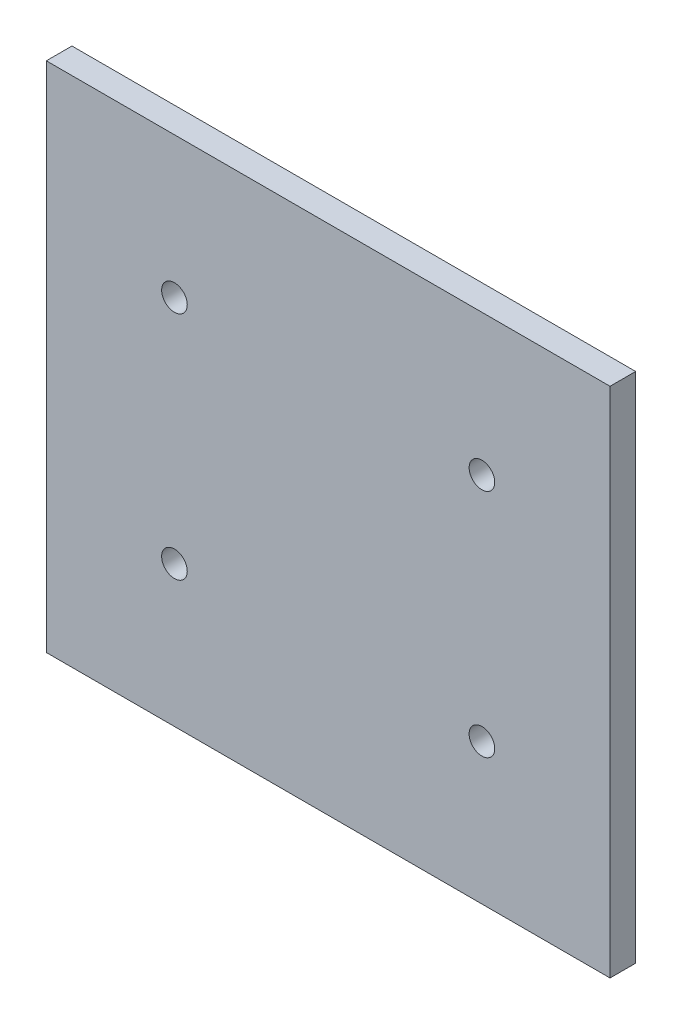
ISO-10303-21;
HEADER;
FILE_DESCRIPTION(('STEP AP214'),'2;1');
FILE_NAME('part.step','',(''),(''),'','','');
FILE_SCHEMA(('AUTOMOTIVE_DESIGN { 1 0 10303 214 1 1 1 1 }'));
ENDSEC;
DATA;
#1=APPLICATION_CONTEXT('core data for automotive mechanical design processes');
#2=APPLICATION_PROTOCOL_DEFINITION('international standard','automotive_design',2000,#1);
#3=PRODUCT_CONTEXT('',#1,'mechanical');
#4=PRODUCT('Part','Part','',(#3));
#5=PRODUCT_RELATED_PRODUCT_CATEGORY('part','',(#4));
#6=PRODUCT_DEFINITION_FORMATION('','',#4);
#7=PRODUCT_DEFINITION_CONTEXT('part definition',#1,'design');
#8=PRODUCT_DEFINITION('design','',#6,#7);
#9=PRODUCT_DEFINITION_SHAPE('','',#8);
#10=(LENGTH_UNIT() NAMED_UNIT(*) SI_UNIT(.MILLI.,.METRE.));
#11=(NAMED_UNIT(*) PLANE_ANGLE_UNIT() SI_UNIT($,.RADIAN.));
#12=(NAMED_UNIT(*) SI_UNIT($,.STERADIAN.) SOLID_ANGLE_UNIT());
#13=UNCERTAINTY_MEASURE_WITH_UNIT(LENGTH_MEASURE(1.E-05),#10,'distance_accuracy_value','');
#14=(GEOMETRIC_REPRESENTATION_CONTEXT(3) GLOBAL_UNCERTAINTY_ASSIGNED_CONTEXT((#13)) GLOBAL_UNIT_ASSIGNED_CONTEXT((#10,
#11,#12)) REPRESENTATION_CONTEXT('',''));
#15=CARTESIAN_POINT('',(0.,0.,0.));
#16=DIRECTION('',(0.,0.,1.));
#17=DIRECTION('',(1.,0.,0.));
#18=AXIS2_PLACEMENT_3D('',#15,#16,#17);
#19=CARTESIAN_POINT('',(0.,0.,3.175));
#20=DIRECTION('',(0.,0.,1.));
#21=DIRECTION('',(1.,0.,0.));
#22=AXIS2_PLACEMENT_3D('',#19,#20,#21);
#23=PLANE('',#22);
#24=CARTESIAN_POINT('',(38.1,0.,3.175));
#25=DIRECTION('',(0.,0.,1.));
#26=DIRECTION('',(1.,0.,0.));
#27=AXIS2_PLACEMENT_3D('',#24,#25,#26);
#28=CIRCLE('',#27,1.5875);
#29=CARTESIAN_POINT('',(39.6875,0.,3.175));
#30=VERTEX_POINT('',#29);
#31=EDGE_CURVE('E121',#30,#30,#28,.T.);
#32=ORIENTED_EDGE('',*,*,#31,.F.);
#33=EDGE_LOOP('',(#32));
#34=FACE_BOUND('',#33,.T.);
#35=CARTESIAN_POINT('',(0.,28.575,3.175));
#36=DIRECTION('',(0.,0.,1.));
#37=DIRECTION('',(1.,0.,0.));
#38=AXIS2_PLACEMENT_3D('',#35,#36,#37);
#39=CIRCLE('',#38,1.5875);
#40=CARTESIAN_POINT('',(1.5875,28.575,3.175));
#41=VERTEX_POINT('',#40);
#42=EDGE_CURVE('E100',#41,#41,#39,.T.);
#43=ORIENTED_EDGE('',*,*,#42,.F.);
#44=EDGE_LOOP('',(#43));
#45=FACE_BOUND('',#44,.T.);
#46=DIRECTION('',(0.,-1.,0.));
#47=VECTOR('',#46,1.);
#48=CARTESIAN_POINT('',(-15.875,46.0375,3.175));
#49=LINE('',#48,#47);
#50=CARTESIAN_POINT('',(-15.875,46.0375,3.175));
#51=VERTEX_POINT('',#50);
#52=CARTESIAN_POINT('',(-15.875,-17.4625,3.175));
#53=VERTEX_POINT('',#52);
#54=EDGE_CURVE('E85',#51,#53,#49,.T.);
#55=ORIENTED_EDGE('',*,*,#54,.T.);
#56=DIRECTION('',(1.,0.,0.));
#57=VECTOR('',#56,1.);
#58=CARTESIAN_POINT('',(-15.875,-17.4625,3.175));
#59=LINE('',#58,#57);
#60=CARTESIAN_POINT('',(53.975,-17.4625,3.175));
#61=VERTEX_POINT('',#60);
#62=EDGE_CURVE('E80',#53,#61,#59,.T.);
#63=ORIENTED_EDGE('',*,*,#62,.T.);
#64=DIRECTION('',(0.,1.,0.));
#65=VECTOR('',#64,1.);
#66=CARTESIAN_POINT('',(53.975,46.0375,3.175));
#67=LINE('',#66,#65);
#68=CARTESIAN_POINT('',(53.975,46.0375,3.175));
#69=VERTEX_POINT('',#68);
#70=EDGE_CURVE('E83',#61,#69,#67,.T.);
#71=ORIENTED_EDGE('',*,*,#70,.T.);
#72=DIRECTION('',(-1.,0.,0.));
#73=VECTOR('',#72,1.);
#74=CARTESIAN_POINT('',(-15.875,46.0375,3.175));
#75=LINE('',#74,#73);
#76=EDGE_CURVE('E50',#69,#51,#75,.T.);
#77=ORIENTED_EDGE('',*,*,#76,.T.);
#78=EDGE_LOOP('',(#55,#63,#71,#77));
#79=FACE_BOUND('',#78,.T.);
#80=CARTESIAN_POINT('',(38.1,28.575,3.175));
#81=DIRECTION('',(0.,0.,1.));
#82=DIRECTION('',(1.,0.,0.));
#83=AXIS2_PLACEMENT_3D('',#80,#81,#82);
#84=CIRCLE('',#83,1.5875);
#85=CARTESIAN_POINT('',(39.6875,28.575,3.175));
#86=VERTEX_POINT('',#85);
#87=EDGE_CURVE('E115',#86,#86,#84,.T.);
#88=ORIENTED_EDGE('',*,*,#87,.F.);
#89=EDGE_LOOP('',(#88));
#90=FACE_BOUND('',#89,.T.);
#91=CARTESIAN_POINT('',(0.,0.,3.175));
#92=DIRECTION('',(0.,0.,1.));
#93=DIRECTION('',(1.,0.,0.));
#94=AXIS2_PLACEMENT_3D('',#91,#92,#93);
#95=CIRCLE('',#94,1.5875);
#96=CARTESIAN_POINT('',(1.5875,0.,3.175));
#97=VERTEX_POINT('',#96);
#98=EDGE_CURVE('E127',#97,#97,#95,.T.);
#99=ORIENTED_EDGE('',*,*,#98,.F.);
#100=EDGE_LOOP('',(#99));
#101=FACE_BOUND('',#100,.T.);
#102=ADVANCED_FACE('F33',(#34,#45,#79,#90,#101),#23,.T.);
#103=CARTESIAN_POINT('',(0.,0.,0.));
#104=DIRECTION('',(0.,0.,1.));
#105=DIRECTION('',(1.,0.,0.));
#106=AXIS2_PLACEMENT_3D('',#103,#104,#105);
#107=PLANE('',#106);
#108=CARTESIAN_POINT('',(38.1,0.,0.));
#109=DIRECTION('',(0.,0.,1.));
#110=DIRECTION('',(1.,0.,0.));
#111=AXIS2_PLACEMENT_3D('',#108,#109,#110);
#112=CIRCLE('',#111,1.5875);
#113=CARTESIAN_POINT('',(39.6875,0.,0.));
#114=VERTEX_POINT('',#113);
#115=EDGE_CURVE('E124',#114,#114,#112,.T.);
#116=ORIENTED_EDGE('',*,*,#115,.T.);
#117=EDGE_LOOP('',(#116));
#118=FACE_BOUND('',#117,.T.);
#119=CARTESIAN_POINT('',(0.,28.575,0.));
#120=DIRECTION('',(0.,0.,1.));
#121=DIRECTION('',(1.,0.,0.));
#122=AXIS2_PLACEMENT_3D('',#119,#120,#121);
#123=CIRCLE('',#122,1.5875);
#124=CARTESIAN_POINT('',(1.5875,28.575,0.));
#125=VERTEX_POINT('',#124);
#126=EDGE_CURVE('E112',#125,#125,#123,.T.);
#127=ORIENTED_EDGE('',*,*,#126,.T.);
#128=EDGE_LOOP('',(#127));
#129=FACE_BOUND('',#128,.T.);
#130=DIRECTION('',(0.,-1.,0.));
#131=VECTOR('',#130,1.);
#132=CARTESIAN_POINT('',(-15.875,46.0375,0.));
#133=LINE('',#132,#131);
#134=CARTESIAN_POINT('',(-15.875,46.0375,0.));
#135=VERTEX_POINT('',#134);
#136=CARTESIAN_POINT('',(-15.875,-17.4625,0.));
#137=VERTEX_POINT('',#136);
#138=EDGE_CURVE('E97',#135,#137,#133,.T.);
#139=ORIENTED_EDGE('',*,*,#138,.F.);
#140=DIRECTION('',(-1.,0.,0.));
#141=VECTOR('',#140,1.);
#142=CARTESIAN_POINT('',(-15.875,46.0375,0.));
#143=LINE('',#142,#141);
#144=CARTESIAN_POINT('',(53.975,46.0375,0.));
#145=VERTEX_POINT('',#144);
#146=EDGE_CURVE('E73',#145,#135,#143,.T.);
#147=ORIENTED_EDGE('',*,*,#146,.F.);
#148=DIRECTION('',(0.,1.,0.));
#149=VECTOR('',#148,1.);
#150=CARTESIAN_POINT('',(53.975,46.0375,0.));
#151=LINE('',#150,#149);
#152=CARTESIAN_POINT('',(53.975,-17.4625,0.));
#153=VERTEX_POINT('',#152);
#154=EDGE_CURVE('E67',#153,#145,#151,.T.);
#155=ORIENTED_EDGE('',*,*,#154,.F.);
#156=DIRECTION('',(1.,0.,0.));
#157=VECTOR('',#156,1.);
#158=CARTESIAN_POINT('',(-15.875,-17.4625,0.));
#159=LINE('',#158,#157);
#160=EDGE_CURVE('E89',#137,#153,#159,.T.);
#161=ORIENTED_EDGE('',*,*,#160,.F.);
#162=EDGE_LOOP('',(#139,#147,#155,#161));
#163=FACE_BOUND('',#162,.T.);
#164=CARTESIAN_POINT('',(38.1,28.575,0.));
#165=DIRECTION('',(0.,0.,1.));
#166=DIRECTION('',(1.,0.,0.));
#167=AXIS2_PLACEMENT_3D('',#164,#165,#166);
#168=CIRCLE('',#167,1.5875);
#169=CARTESIAN_POINT('',(39.6875,28.575,0.));
#170=VERTEX_POINT('',#169);
#171=EDGE_CURVE('E118',#170,#170,#168,.T.);
#172=ORIENTED_EDGE('',*,*,#171,.T.);
#173=EDGE_LOOP('',(#172));
#174=FACE_BOUND('',#173,.T.);
#175=CARTESIAN_POINT('',(0.,0.,0.));
#176=DIRECTION('',(0.,0.,1.));
#177=DIRECTION('',(1.,0.,0.));
#178=AXIS2_PLACEMENT_3D('',#175,#176,#177);
#179=CIRCLE('',#178,1.5875);
#180=CARTESIAN_POINT('',(1.5875,0.,0.));
#181=VERTEX_POINT('',#180);
#182=EDGE_CURVE('E130',#181,#181,#179,.T.);
#183=ORIENTED_EDGE('',*,*,#182,.T.);
#184=EDGE_LOOP('',(#183));
#185=FACE_BOUND('',#184,.T.);
#186=ADVANCED_FACE('F108',(#118,#129,#163,#174,#185),#107,.F.);
#187=CARTESIAN_POINT('',(-15.875,46.0375,3.175));
#188=DIRECTION('',(1.,0.,0.));
#189=DIRECTION('',(0.,1.,0.));
#190=AXIS2_PLACEMENT_3D('',#187,#188,#189);
#191=PLANE('',#190);
#192=ORIENTED_EDGE('',*,*,#138,.T.);
#193=DIRECTION('',(0.,0.,-1.));
#194=VECTOR('',#193,1.);
#195=CARTESIAN_POINT('',(-15.875,-17.4625,3.175));
#196=LINE('',#195,#194);
#197=EDGE_CURVE('E11',#53,#137,#196,.T.);
#198=ORIENTED_EDGE('',*,*,#197,.F.);
#199=ORIENTED_EDGE('',*,*,#54,.F.);
#200=DIRECTION('',(0.,0.,-1.));
#201=VECTOR('',#200,1.);
#202=CARTESIAN_POINT('',(-15.875,46.0375,3.175));
#203=LINE('',#202,#201);
#204=EDGE_CURVE('E93',#51,#135,#203,.T.);
#205=ORIENTED_EDGE('',*,*,#204,.T.);
#206=EDGE_LOOP('',(#192,#198,#199,#205));
#207=FACE_BOUND('',#206,.T.);
#208=ADVANCED_FACE('F35',(#207),#191,.F.);
#209=CARTESIAN_POINT('',(-15.875,-17.4625,3.175));
#210=DIRECTION('',(0.,1.,0.));
#211=DIRECTION('',(-1.,0.,0.));
#212=AXIS2_PLACEMENT_3D('',#209,#210,#211);
#213=PLANE('',#212);
#214=ORIENTED_EDGE('',*,*,#160,.T.);
#215=DIRECTION('',(0.,0.,-1.));
#216=VECTOR('',#215,1.);
#217=CARTESIAN_POINT('',(53.975,-17.4625,3.175));
#218=LINE('',#217,#216);
#219=EDGE_CURVE('E42',#61,#153,#218,.T.);
#220=ORIENTED_EDGE('',*,*,#219,.F.);
#221=ORIENTED_EDGE('',*,*,#62,.F.);
#222=ORIENTED_EDGE('',*,*,#197,.T.);
#223=EDGE_LOOP('',(#214,#220,#221,#222));
#224=FACE_BOUND('',#223,.T.);
#225=ADVANCED_FACE('F88',(#224),#213,.F.);
#226=CARTESIAN_POINT('',(53.975,46.0375,3.175));
#227=DIRECTION('',(-1.,0.,0.));
#228=DIRECTION('',(0.,0.,1.));
#229=AXIS2_PLACEMENT_3D('',#226,#227,#228);
#230=PLANE('',#229);
#231=ORIENTED_EDGE('',*,*,#154,.T.);
#232=DIRECTION('',(0.,0.,-1.));
#233=VECTOR('',#232,1.);
#234=CARTESIAN_POINT('',(53.975,46.0375,3.175));
#235=LINE('',#234,#233);
#236=EDGE_CURVE('E90',#69,#145,#235,.T.);
#237=ORIENTED_EDGE('',*,*,#236,.F.);
#238=ORIENTED_EDGE('',*,*,#70,.F.);
#239=ORIENTED_EDGE('',*,*,#219,.T.);
#240=EDGE_LOOP('',(#231,#237,#238,#239));
#241=FACE_BOUND('',#240,.T.);
#242=ADVANCED_FACE('F91',(#241),#230,.F.);
#243=CARTESIAN_POINT('',(-15.875,46.0375,3.175));
#244=DIRECTION('',(0.,-1.,0.));
#245=DIRECTION('',(1.,0.,0.));
#246=AXIS2_PLACEMENT_3D('',#243,#244,#245);
#247=PLANE('',#246);
#248=ORIENTED_EDGE('',*,*,#146,.T.);
#249=ORIENTED_EDGE('',*,*,#204,.F.);
#250=ORIENTED_EDGE('',*,*,#76,.F.);
#251=ORIENTED_EDGE('',*,*,#236,.T.);
#252=EDGE_LOOP('',(#248,#249,#250,#251));
#253=FACE_BOUND('',#252,.T.);
#254=ADVANCED_FACE('F105',(#253),#247,.F.);
#255=CARTESIAN_POINT('',(0.,28.575,3.175));
#256=DIRECTION('',(0.,0.,-1.));
#257=DIRECTION('',(-1.,0.,0.));
#258=AXIS2_PLACEMENT_3D('',#255,#256,#257);
#259=CYLINDRICAL_SURFACE('',#258,1.5875);
#260=ORIENTED_EDGE('',*,*,#42,.T.);
#261=EDGE_LOOP('',(#260));
#262=FACE_BOUND('',#261,.T.);
#263=ORIENTED_EDGE('',*,*,#126,.F.);
#264=EDGE_LOOP('',(#263));
#265=FACE_BOUND('',#264,.T.);
#266=ADVANCED_FACE('F150',(#262,#265),#259,.F.);
#267=CARTESIAN_POINT('',(38.1,28.575,3.175));
#268=DIRECTION('',(0.,0.,-1.));
#269=DIRECTION('',(-1.,0.,0.));
#270=AXIS2_PLACEMENT_3D('',#267,#268,#269);
#271=CYLINDRICAL_SURFACE('',#270,1.5875);
#272=ORIENTED_EDGE('',*,*,#87,.T.);
#273=EDGE_LOOP('',(#272));
#274=FACE_BOUND('',#273,.T.);
#275=ORIENTED_EDGE('',*,*,#171,.F.);
#276=EDGE_LOOP('',(#275));
#277=FACE_BOUND('',#276,.T.);
#278=ADVANCED_FACE('F196',(#274,#277),#271,.F.);
#279=CARTESIAN_POINT('',(38.1,0.,3.175));
#280=DIRECTION('',(0.,0.,-1.));
#281=DIRECTION('',(-1.,0.,0.));
#282=AXIS2_PLACEMENT_3D('',#279,#280,#281);
#283=CYLINDRICAL_SURFACE('',#282,1.5875);
#284=ORIENTED_EDGE('',*,*,#31,.T.);
#285=EDGE_LOOP('',(#284));
#286=FACE_BOUND('',#285,.T.);
#287=ORIENTED_EDGE('',*,*,#115,.F.);
#288=EDGE_LOOP('',(#287));
#289=FACE_BOUND('',#288,.T.);
#290=ADVANCED_FACE('F204',(#286,#289),#283,.F.);
#291=CARTESIAN_POINT('',(0.,0.,3.175));
#292=DIRECTION('',(0.,0.,-1.));
#293=DIRECTION('',(-1.,0.,0.));
#294=AXIS2_PLACEMENT_3D('',#291,#292,#293);
#295=CYLINDRICAL_SURFACE('',#294,1.5875);
#296=ORIENTED_EDGE('',*,*,#98,.T.);
#297=EDGE_LOOP('',(#296));
#298=FACE_BOUND('',#297,.T.);
#299=ORIENTED_EDGE('',*,*,#182,.F.);
#300=EDGE_LOOP('',(#299));
#301=FACE_BOUND('',#300,.T.);
#302=ADVANCED_FACE('F136',(#298,#301),#295,.F.);
#303=CLOSED_SHELL('',(#102,#186,#208,#225,#242,#254,#266,#278,#290,#302));
#304=MANIFOLD_SOLID_BREP('B2',#303);
#305=ADVANCED_BREP_SHAPE_REPRESENTATION('',(#18,#304),#14);
#306=SHAPE_DEFINITION_REPRESENTATION(#9,#305);
ENDSEC;
END-ISO-10303-21;
